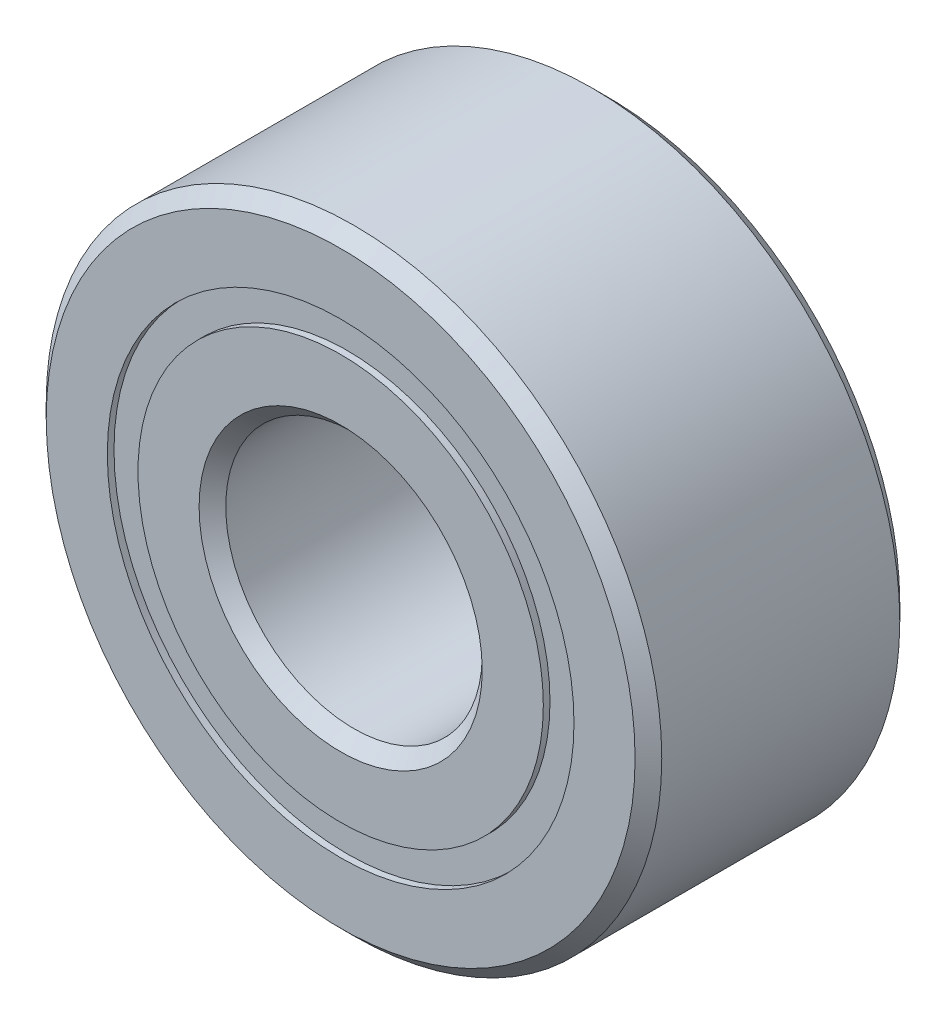
ISO-10303-21;
HEADER;
FILE_DESCRIPTION(('STEP AP214'),'2;1');
FILE_NAME('part.step','',(''),(''),'','','');
FILE_SCHEMA(('AUTOMOTIVE_DESIGN { 1 0 10303 214 1 1 1 1 }'));
ENDSEC;
DATA;
#1=APPLICATION_CONTEXT('core data for automotive mechanical design processes');
#2=APPLICATION_PROTOCOL_DEFINITION('international standard','automotive_design',2000,#1);
#3=PRODUCT_CONTEXT('',#1,'mechanical');
#4=PRODUCT('Part','Part','',(#3));
#5=PRODUCT_RELATED_PRODUCT_CATEGORY('part','',(#4));
#6=PRODUCT_DEFINITION_FORMATION('','',#4);
#7=PRODUCT_DEFINITION_CONTEXT('part definition',#1,'design');
#8=PRODUCT_DEFINITION('design','',#6,#7);
#9=PRODUCT_DEFINITION_SHAPE('','',#8);
#10=(LENGTH_UNIT() NAMED_UNIT(*) SI_UNIT(.MILLI.,.METRE.));
#11=(NAMED_UNIT(*) PLANE_ANGLE_UNIT() SI_UNIT($,.RADIAN.));
#12=(NAMED_UNIT(*) SI_UNIT($,.STERADIAN.) SOLID_ANGLE_UNIT());
#13=UNCERTAINTY_MEASURE_WITH_UNIT(LENGTH_MEASURE(1.E-05),#10,'distance_accuracy_value','');
#14=(GEOMETRIC_REPRESENTATION_CONTEXT(3) GLOBAL_UNCERTAINTY_ASSIGNED_CONTEXT((#13)) GLOBAL_UNIT_ASSIGNED_CONTEXT((#10,
#11,#12)) REPRESENTATION_CONTEXT('',''));
#15=CARTESIAN_POINT('',(0.,0.,0.));
#16=DIRECTION('',(0.,0.,1.));
#17=DIRECTION('',(1.,0.,0.));
#18=AXIS2_PLACEMENT_3D('',#15,#16,#17);
#19=CARTESIAN_POINT('',(0.,1.97554945054946,1.3));
#20=DIRECTION('',(0.,0.,-1.));
#21=DIRECTION('',(-1.,0.,0.));
#22=AXIS2_PLACEMENT_3D('',#19,#20,#21);
#23=PLANE('',#22);
#24=CARTESIAN_POINT('',(0.,0.,1.3));
#25=DIRECTION('',(0.,0.,1.));
#26=DIRECTION('',(1.,0.,0.));
#27=AXIS2_PLACEMENT_3D('',#24,#25,#26);
#28=CIRCLE('',#27,1.38);
#29=CARTESIAN_POINT('',(1.38,0.,1.3));
#30=VERTEX_POINT('',#29);
#31=EDGE_CURVE('P0_E43',#30,#30,#28,.T.);
#32=ORIENTED_EDGE('',*,*,#31,.F.);
#33=EDGE_LOOP('',(#32));
#34=FACE_BOUND('',#33,.T.);
#35=CARTESIAN_POINT('',(0.,0.,1.3));
#36=DIRECTION('',(0.,0.,1.));
#37=DIRECTION('',(1.,0.,0.));
#38=AXIS2_PLACEMENT_3D('',#35,#36,#37);
#39=CIRCLE('',#38,1.97554945054946);
#40=CARTESIAN_POINT('',(1.97554945054946,0.,1.3));
#41=VERTEX_POINT('',#40);
#42=EDGE_CURVE('P0_E10',#41,#41,#39,.T.);
#43=ORIENTED_EDGE('',*,*,#42,.T.);
#44=EDGE_LOOP('',(#43));
#45=FACE_BOUND('',#44,.T.);
#46=ADVANCED_FACE('P0_F15',(#34,#45),#23,.F.);
#47=CARTESIAN_POINT('',(0.,0.,1.3));
#48=DIRECTION('',(0.,0.,1.));
#49=DIRECTION('',(1.,0.,0.));
#50=AXIS2_PLACEMENT_3D('',#47,#48,#49);
#51=CYLINDRICAL_SURFACE('',#50,1.97554945054946);
#52=ORIENTED_EDGE('',*,*,#42,.F.);
#53=EDGE_LOOP('',(#52));
#54=FACE_BOUND('',#53,.T.);
#55=CARTESIAN_POINT('',(0.,0.,0.577777777777777));
#56=DIRECTION('',(0.,0.,1.));
#57=DIRECTION('',(1.,0.,0.));
#58=AXIS2_PLACEMENT_3D('',#55,#56,#57);
#59=CIRCLE('',#58,1.97554945054946);
#60=CARTESIAN_POINT('',(1.97554945054946,0.,0.577777777777777));
#61=VERTEX_POINT('',#60);
#62=EDGE_CURVE('P0_E21',#61,#61,#59,.T.);
#63=ORIENTED_EDGE('',*,*,#62,.T.);
#64=EDGE_LOOP('',(#63));
#65=FACE_BOUND('',#64,.T.);
#66=ADVANCED_FACE('P0_F50',(#54,#65),#51,.T.);
#67=CARTESIAN_POINT('',(0.,0.,0.));
#68=DIRECTION('',(0.,0.,1.));
#69=DIRECTION('',(1.,0.,0.));
#70=AXIS2_PLACEMENT_3D('',#67,#68,#69);
#71=TOROIDAL_SURFACE('',#70,2.125,0.596793621970691);
#72=ORIENTED_EDGE('',*,*,#62,.F.);
#73=EDGE_LOOP('',(#72));
#74=FACE_BOUND('',#73,.T.);
#75=CARTESIAN_POINT('',(0.,0.,-0.577777777777778));
#76=DIRECTION('',(0.,0.,1.));
#77=DIRECTION('',(1.,0.,0.));
#78=AXIS2_PLACEMENT_3D('',#75,#76,#77);
#79=CIRCLE('',#78,1.97554945054946);
#80=CARTESIAN_POINT('',(1.97554945054946,0.,-0.577777777777778));
#81=VERTEX_POINT('',#80);
#82=EDGE_CURVE('P0_E25',#81,#81,#79,.T.);
#83=ORIENTED_EDGE('',*,*,#82,.T.);
#84=EDGE_LOOP('',(#83));
#85=FACE_BOUND('',#84,.T.);
#86=ADVANCED_FACE('P0_F55',(#74,#85),#71,.F.);
#87=CARTESIAN_POINT('',(0.,0.,1.3));
#88=DIRECTION('',(0.,0.,1.));
#89=DIRECTION('',(1.,0.,0.));
#90=AXIS2_PLACEMENT_3D('',#87,#88,#89);
#91=CYLINDRICAL_SURFACE('',#90,1.97554945054946);
#92=ORIENTED_EDGE('',*,*,#82,.F.);
#93=EDGE_LOOP('',(#92));
#94=FACE_BOUND('',#93,.T.);
#95=CARTESIAN_POINT('',(0.,0.,-1.3));
#96=DIRECTION('',(0.,0.,1.));
#97=DIRECTION('',(1.,0.,0.));
#98=AXIS2_PLACEMENT_3D('',#95,#96,#97);
#99=CIRCLE('',#98,1.97554945054946);
#100=CARTESIAN_POINT('',(1.97554945054946,0.,-1.3));
#101=VERTEX_POINT('',#100);
#102=EDGE_CURVE('P0_E29',#101,#101,#99,.T.);
#103=ORIENTED_EDGE('',*,*,#102,.T.);
#104=EDGE_LOOP('',(#103));
#105=FACE_BOUND('',#104,.T.);
#106=ADVANCED_FACE('P0_F60',(#94,#105),#91,.T.);
#107=CARTESIAN_POINT('',(0.,1.38,-1.3));
#108=DIRECTION('',(0.,0.,1.));
#109=DIRECTION('',(1.,0.,0.));
#110=AXIS2_PLACEMENT_3D('',#107,#108,#109);
#111=PLANE('',#110);
#112=ORIENTED_EDGE('',*,*,#102,.F.);
#113=EDGE_LOOP('',(#112));
#114=FACE_BOUND('',#113,.T.);
#115=CARTESIAN_POINT('',(0.,0.,-1.3));
#116=DIRECTION('',(0.,0.,1.));
#117=DIRECTION('',(1.,0.,0.));
#118=AXIS2_PLACEMENT_3D('',#115,#116,#117);
#119=CIRCLE('',#118,1.38);
#120=CARTESIAN_POINT('',(1.38,0.,-1.3));
#121=VERTEX_POINT('',#120);
#122=EDGE_CURVE('P0_E34',#121,#121,#119,.T.);
#123=ORIENTED_EDGE('',*,*,#122,.T.);
#124=EDGE_LOOP('',(#123));
#125=FACE_BOUND('',#124,.T.);
#126=ADVANCED_FACE('P0_F66',(#114,#125),#111,.F.);
#127=CARTESIAN_POINT('',(0.,0.,-1.17));
#128=DIRECTION('',(0.,0.,-1.));
#129=DIRECTION('',(-1.,0.,0.));
#130=AXIS2_PLACEMENT_3D('',#127,#128,#129);
#131=CONICAL_SURFACE('',#130,1.25,0.785398163397436);
#132=ORIENTED_EDGE('',*,*,#122,.F.);
#133=EDGE_LOOP('',(#132));
#134=FACE_BOUND('',#133,.T.);
#135=CARTESIAN_POINT('',(0.,0.,-1.17));
#136=DIRECTION('',(0.,0.,1.));
#137=DIRECTION('',(1.,0.,0.));
#138=AXIS2_PLACEMENT_3D('',#135,#136,#137);
#139=CIRCLE('',#138,1.25);
#140=CARTESIAN_POINT('',(1.25,0.,-1.17));
#141=VERTEX_POINT('',#140);
#142=EDGE_CURVE('P0_E37',#141,#141,#139,.T.);
#143=ORIENTED_EDGE('',*,*,#142,.T.);
#144=EDGE_LOOP('',(#143));
#145=FACE_BOUND('',#144,.T.);
#146=ADVANCED_FACE('P0_F70',(#134,#145),#131,.F.);
#147=CARTESIAN_POINT('',(0.,0.,1.3));
#148=DIRECTION('',(0.,0.,1.));
#149=DIRECTION('',(1.,0.,0.));
#150=AXIS2_PLACEMENT_3D('',#147,#148,#149);
#151=CYLINDRICAL_SURFACE('',#150,1.25);
#152=ORIENTED_EDGE('',*,*,#142,.F.);
#153=EDGE_LOOP('',(#152));
#154=FACE_BOUND('',#153,.T.);
#155=CARTESIAN_POINT('',(0.,0.,1.17));
#156=DIRECTION('',(0.,0.,1.));
#157=DIRECTION('',(1.,0.,0.));
#158=AXIS2_PLACEMENT_3D('',#155,#156,#157);
#159=CIRCLE('',#158,1.25);
#160=CARTESIAN_POINT('',(1.25,0.,1.17));
#161=VERTEX_POINT('',#160);
#162=EDGE_CURVE('P0_E40',#161,#161,#159,.T.);
#163=ORIENTED_EDGE('',*,*,#162,.T.);
#164=EDGE_LOOP('',(#163));
#165=FACE_BOUND('',#164,.T.);
#166=ADVANCED_FACE('P0_F74',(#154,#165),#151,.F.);
#167=CARTESIAN_POINT('',(0.,0.,1.3));
#168=DIRECTION('',(0.,0.,1.));
#169=DIRECTION('',(1.,0.,0.));
#170=AXIS2_PLACEMENT_3D('',#167,#168,#169);
#171=CONICAL_SURFACE('',#170,1.38,0.785398163397462);
#172=ORIENTED_EDGE('',*,*,#162,.F.);
#173=EDGE_LOOP('',(#172));
#174=FACE_BOUND('',#173,.T.);
#175=ORIENTED_EDGE('',*,*,#31,.T.);
#176=EDGE_LOOP('',(#175));
#177=FACE_BOUND('',#176,.T.);
#178=ADVANCED_FACE('P0_F47',(#174,#177),#171,.F.);
#179=CLOSED_SHELL('',(#46,#66,#86,#106,#126,#146,#166,#178));
#180=MANIFOLD_SOLID_BREP('P0_B1',#179);
#181=CARTESIAN_POINT('',(-2.02099509712719,0.656661113046786,0.));
#182=DIRECTION('',(0.,0.,1.));
#183=DIRECTION('',(-0.95105651629515,0.309016994374958,0.));
#184=AXIS2_PLACEMENT_3D('',#181,#182,#183);
#185=SPHERICAL_SURFACE('',#184,0.596793621970693);
#186=CARTESIAN_POINT('',(-2.02099509712719,0.656661113046786,0.596793621970692));
#187=VERTEX_POINT('',#186);
#188=VERTEX_LOOP('',#187);
#189=FACE_BOUND('',#188,.T.);
#190=ADVANCED_FACE('P1_F13',(#189),#185,.T.);
#191=CLOSED_SHELL('',(#190));
#192=MANIFOLD_SOLID_BREP('P1_B1',#191);
#193=CARTESIAN_POINT('',(-1.24904366112148,1.71916111304678,0.));
#194=DIRECTION('',(0.,0.,1.));
#195=DIRECTION('',(-0.587785252292463,0.809016994374955,0.));
#196=AXIS2_PLACEMENT_3D('',#193,#194,#195);
#197=SPHERICAL_SURFACE('',#196,0.596793621970693);
#198=CARTESIAN_POINT('',(-1.24904366112148,1.71916111304678,0.596793621970692));
#199=VERTEX_POINT('',#198);
#200=VERTEX_LOOP('',#199);
#201=FACE_BOUND('',#200,.T.);
#202=ADVANCED_FACE('P2_F13',(#201),#197,.T.);
#203=CLOSED_SHELL('',(#202));
#204=MANIFOLD_SOLID_BREP('P2_B1',#203);
#205=CARTESIAN_POINT('',(0.,2.27445054945055,1.235));
#206=DIRECTION('',(0.,0.,-1.));
#207=DIRECTION('',(-1.,0.,0.));
#208=AXIS2_PLACEMENT_3D('',#205,#206,#207);
#209=PLANE('',#208);
#210=CARTESIAN_POINT('',(0.,0.,1.235));
#211=DIRECTION('',(0.,0.,1.));
#212=DIRECTION('',(1.,0.,0.));
#213=AXIS2_PLACEMENT_3D('',#210,#211,#212);
#214=CIRCLE('',#213,1.97554945054946);
#215=CARTESIAN_POINT('',(1.97554945054946,0.,1.235));
#216=VERTEX_POINT('',#215);
#217=EDGE_CURVE('P3_E10',#216,#216,#214,.T.);
#218=ORIENTED_EDGE('',*,*,#217,.F.);
#219=EDGE_LOOP('',(#218));
#220=FACE_BOUND('',#219,.T.);
#221=CARTESIAN_POINT('',(0.,0.,1.235));
#222=DIRECTION('',(0.,0.,1.));
#223=DIRECTION('',(1.,0.,0.));
#224=AXIS2_PLACEMENT_3D('',#221,#222,#223);
#225=CIRCLE('',#224,2.27445054945055);
#226=CARTESIAN_POINT('',(2.27445054945055,0.,1.235));
#227=VERTEX_POINT('',#226);
#228=EDGE_CURVE('P3_E29',#227,#227,#225,.T.);
#229=ORIENTED_EDGE('',*,*,#228,.T.);
#230=EDGE_LOOP('',(#229));
#231=FACE_BOUND('',#230,.T.);
#232=ADVANCED_FACE('P3_F15',(#220,#231),#209,.F.);
#233=CARTESIAN_POINT('',(0.,0.,1.3));
#234=DIRECTION('',(0.,0.,1.));
#235=DIRECTION('',(1.,0.,0.));
#236=AXIS2_PLACEMENT_3D('',#233,#234,#235);
#237=CYLINDRICAL_SURFACE('',#236,1.97554945054946);
#238=CARTESIAN_POINT('',(0.,0.,0.596793621970692));
#239=DIRECTION('',(0.,0.,1.));
#240=DIRECTION('',(1.,0.,0.));
#241=AXIS2_PLACEMENT_3D('',#238,#239,#240);
#242=CIRCLE('',#241,1.97554945054946);
#243=CARTESIAN_POINT('',(1.97554945054946,0.,0.596793621970692));
#244=VERTEX_POINT('',#243);
#245=EDGE_CURVE('P3_E21',#244,#244,#242,.T.);
#246=ORIENTED_EDGE('',*,*,#245,.F.);
#247=EDGE_LOOP('',(#246));
#248=FACE_BOUND('',#247,.T.);
#249=ORIENTED_EDGE('',*,*,#217,.T.);
#250=EDGE_LOOP('',(#249));
#251=FACE_BOUND('',#250,.T.);
#252=ADVANCED_FACE('P3_F44',(#248,#251),#237,.F.);
#253=CARTESIAN_POINT('',(0.,2.27445054945055,0.596793621970692));
#254=DIRECTION('',(0.,0.,1.));
#255=DIRECTION('',(1.,0.,0.));
#256=AXIS2_PLACEMENT_3D('',#253,#254,#255);
#257=PLANE('',#256);
#258=CARTESIAN_POINT('',(0.,0.,0.596793621970692));
#259=DIRECTION('',(0.,0.,1.));
#260=DIRECTION('',(1.,0.,0.));
#261=AXIS2_PLACEMENT_3D('',#258,#259,#260);
#262=CIRCLE('',#261,2.27445054945055);
#263=CARTESIAN_POINT('',(2.27445054945055,0.,0.596793621970692));
#264=VERTEX_POINT('',#263);
#265=EDGE_CURVE('P3_E25',#264,#264,#262,.T.);
#266=ORIENTED_EDGE('',*,*,#265,.F.);
#267=EDGE_LOOP('',(#266));
#268=FACE_BOUND('',#267,.T.);
#269=ORIENTED_EDGE('',*,*,#245,.T.);
#270=EDGE_LOOP('',(#269));
#271=FACE_BOUND('',#270,.T.);
#272=ADVANCED_FACE('P3_F39',(#268,#271),#257,.F.);
#273=CARTESIAN_POINT('',(0.,0.,1.3));
#274=DIRECTION('',(0.,0.,1.));
#275=DIRECTION('',(1.,0.,0.));
#276=AXIS2_PLACEMENT_3D('',#273,#274,#275);
#277=CYLINDRICAL_SURFACE('',#276,2.27445054945055);
#278=ORIENTED_EDGE('',*,*,#228,.F.);
#279=EDGE_LOOP('',(#278));
#280=FACE_BOUND('',#279,.T.);
#281=ORIENTED_EDGE('',*,*,#265,.T.);
#282=EDGE_LOOP('',(#281));
#283=FACE_BOUND('',#282,.T.);
#284=ADVANCED_FACE('P3_F36',(#280,#283),#277,.T.);
#285=CLOSED_SHELL('',(#232,#252,#272,#284));
#286=MANIFOLD_SOLID_BREP('P3_B1',#285);
#287=CARTESIAN_POINT('',(0.,2.27445054945055,-1.235));
#288=DIRECTION('',(0.,0.,1.));
#289=DIRECTION('',(1.,0.,0.));
#290=AXIS2_PLACEMENT_3D('',#287,#288,#289);
#291=PLANE('',#290);
#292=CARTESIAN_POINT('',(0.,0.,-1.235));
#293=DIRECTION('',(0.,0.,1.));
#294=DIRECTION('',(1.,0.,0.));
#295=AXIS2_PLACEMENT_3D('',#292,#293,#294);
#296=CIRCLE('',#295,2.27445054945055);
#297=CARTESIAN_POINT('',(2.27445054945055,0.,-1.235));
#298=VERTEX_POINT('',#297);
#299=EDGE_CURVE('P4_E29',#298,#298,#296,.T.);
#300=ORIENTED_EDGE('',*,*,#299,.F.);
#301=EDGE_LOOP('',(#300));
#302=FACE_BOUND('',#301,.T.);
#303=CARTESIAN_POINT('',(0.,0.,-1.235));
#304=DIRECTION('',(0.,0.,1.));
#305=DIRECTION('',(1.,0.,0.));
#306=AXIS2_PLACEMENT_3D('',#303,#304,#305);
#307=CIRCLE('',#306,1.97554945054946);
#308=CARTESIAN_POINT('',(1.97554945054946,0.,-1.235));
#309=VERTEX_POINT('',#308);
#310=EDGE_CURVE('P4_E10',#309,#309,#307,.T.);
#311=ORIENTED_EDGE('',*,*,#310,.T.);
#312=EDGE_LOOP('',(#311));
#313=FACE_BOUND('',#312,.T.);
#314=ADVANCED_FACE('P4_F15',(#302,#313),#291,.F.);
#315=CARTESIAN_POINT('',(0.,0.,1.3));
#316=DIRECTION('',(0.,0.,1.));
#317=DIRECTION('',(1.,0.,0.));
#318=AXIS2_PLACEMENT_3D('',#315,#316,#317);
#319=CYLINDRICAL_SURFACE('',#318,1.97554945054946);
#320=ORIENTED_EDGE('',*,*,#310,.F.);
#321=EDGE_LOOP('',(#320));
#322=FACE_BOUND('',#321,.T.);
#323=CARTESIAN_POINT('',(0.,0.,-0.596793621970694));
#324=DIRECTION('',(0.,0.,1.));
#325=DIRECTION('',(1.,0.,0.));
#326=AXIS2_PLACEMENT_3D('',#323,#324,#325);
#327=CIRCLE('',#326,1.97554945054946);
#328=CARTESIAN_POINT('',(1.97554945054946,0.,-0.596793621970694));
#329=VERTEX_POINT('',#328);
#330=EDGE_CURVE('P4_E21',#329,#329,#327,.T.);
#331=ORIENTED_EDGE('',*,*,#330,.T.);
#332=EDGE_LOOP('',(#331));
#333=FACE_BOUND('',#332,.T.);
#334=ADVANCED_FACE('P4_F38',(#322,#333),#319,.F.);
#335=CARTESIAN_POINT('',(0.,2.27445054945055,-0.596793621970694));
#336=DIRECTION('',(0.,0.,-1.));
#337=DIRECTION('',(-1.,0.,0.));
#338=AXIS2_PLACEMENT_3D('',#335,#336,#337);
#339=PLANE('',#338);
#340=ORIENTED_EDGE('',*,*,#330,.F.);
#341=EDGE_LOOP('',(#340));
#342=FACE_BOUND('',#341,.T.);
#343=CARTESIAN_POINT('',(0.,0.,-0.596793621970694));
#344=DIRECTION('',(0.,0.,1.));
#345=DIRECTION('',(1.,0.,0.));
#346=AXIS2_PLACEMENT_3D('',#343,#344,#345);
#347=CIRCLE('',#346,2.27445054945055);
#348=CARTESIAN_POINT('',(2.27445054945055,0.,-0.596793621970694));
#349=VERTEX_POINT('',#348);
#350=EDGE_CURVE('P4_E25',#349,#349,#347,.T.);
#351=ORIENTED_EDGE('',*,*,#350,.T.);
#352=EDGE_LOOP('',(#351));
#353=FACE_BOUND('',#352,.T.);
#354=ADVANCED_FACE('P4_F43',(#342,#353),#339,.F.);
#355=CARTESIAN_POINT('',(0.,0.,1.3));
#356=DIRECTION('',(0.,0.,1.));
#357=DIRECTION('',(1.,0.,0.));
#358=AXIS2_PLACEMENT_3D('',#355,#356,#357);
#359=CYLINDRICAL_SURFACE('',#358,2.27445054945055);
#360=ORIENTED_EDGE('',*,*,#350,.F.);
#361=EDGE_LOOP('',(#360));
#362=FACE_BOUND('',#361,.T.);
#363=ORIENTED_EDGE('',*,*,#299,.T.);
#364=EDGE_LOOP('',(#363));
#365=FACE_BOUND('',#364,.T.);
#366=ADVANCED_FACE('P4_F35',(#362,#365),#359,.T.);
#367=CLOSED_SHELL('',(#314,#334,#354,#366));
#368=MANIFOLD_SOLID_BREP('P4_B1',#367);
#369=CARTESIAN_POINT('',(0.,2.87,-1.3));
#370=DIRECTION('',(0.,0.,1.));
#371=DIRECTION('',(1.,0.,0.));
#372=AXIS2_PLACEMENT_3D('',#369,#370,#371);
#373=PLANE('',#372);
#374=CARTESIAN_POINT('',(0.,0.,-1.3));
#375=DIRECTION('',(0.,0.,1.));
#376=DIRECTION('',(1.,0.,0.));
#377=AXIS2_PLACEMENT_3D('',#374,#375,#376);
#378=CIRCLE('',#377,2.85);
#379=CARTESIAN_POINT('',(2.85,0.,-1.3));
#380=VERTEX_POINT('',#379);
#381=EDGE_CURVE('P5_E10',#380,#380,#378,.F.);
#382=ORIENTED_EDGE('',*,*,#381,.T.);
#383=EDGE_LOOP('',(#382));
#384=FACE_BOUND('',#383,.T.);
#385=CARTESIAN_POINT('',(0.,0.,-1.3));
#386=DIRECTION('',(0.,0.,1.));
#387=DIRECTION('',(1.,0.,0.));
#388=AXIS2_PLACEMENT_3D('',#385,#386,#387);
#389=CIRCLE('',#388,2.27445054945055);
#390=CARTESIAN_POINT('',(2.27445054945055,0.,-1.3));
#391=VERTEX_POINT('',#390);
#392=EDGE_CURVE('P5_E31',#391,#391,#389,.T.);
#393=ORIENTED_EDGE('',*,*,#392,.T.);
#394=EDGE_LOOP('',(#393));
#395=FACE_BOUND('',#394,.T.);
#396=ADVANCED_FACE('P5_F15',(#384,#395),#373,.F.);
#397=CARTESIAN_POINT('',(0.,0.,1.17));
#398=DIRECTION('',(0.,0.,-1.));
#399=DIRECTION('',(-1.,0.,0.));
#400=AXIS2_PLACEMENT_3D('',#397,#398,#399);
#401=CONICAL_SURFACE('',#400,3.,0.78539816339744);
#402=CARTESIAN_POINT('',(0.,0.,1.3));
#403=DIRECTION('',(0.,0.,1.));
#404=DIRECTION('',(1.,0.,0.));
#405=AXIS2_PLACEMENT_3D('',#402,#403,#404);
#406=CIRCLE('',#405,2.87);
#407=CARTESIAN_POINT('',(2.87,0.,1.3));
#408=VERTEX_POINT('',#407);
#409=EDGE_CURVE('P5_E36',#408,#408,#406,.T.);
#410=ORIENTED_EDGE('',*,*,#409,.F.);
#411=EDGE_LOOP('',(#410));
#412=FACE_BOUND('',#411,.T.);
#413=CARTESIAN_POINT('',(0.,0.,1.17));
#414=DIRECTION('',(0.,0.,1.));
#415=DIRECTION('',(1.,0.,0.));
#416=AXIS2_PLACEMENT_3D('',#413,#414,#415);
#417=CIRCLE('',#416,3.);
#418=CARTESIAN_POINT('',(3.,0.,1.17));
#419=VERTEX_POINT('',#418);
#420=EDGE_CURVE('P5_E27',#419,#419,#417,.T.);
#421=ORIENTED_EDGE('',*,*,#420,.T.);
#422=EDGE_LOOP('',(#421));
#423=FACE_BOUND('',#422,.T.);
#424=ADVANCED_FACE('P5_F71',(#412,#423),#401,.T.);
#425=CARTESIAN_POINT('',(0.,0.,1.3));
#426=DIRECTION('',(0.,0.,1.));
#427=DIRECTION('',(1.,0.,0.));
#428=AXIS2_PLACEMENT_3D('',#425,#426,#427);
#429=CYLINDRICAL_SURFACE('',#428,3.);
#430=CARTESIAN_POINT('',(0.,0.,-1.15));
#431=DIRECTION('',(0.,0.,1.));
#432=DIRECTION('',(1.,0.,0.));
#433=AXIS2_PLACEMENT_3D('',#430,#431,#432);
#434=CIRCLE('',#433,3.);
#435=CARTESIAN_POINT('',(3.,0.,-1.15));
#436=VERTEX_POINT('',#435);
#437=EDGE_CURVE('P5_E23',#436,#436,#434,.T.);
#438=ORIENTED_EDGE('',*,*,#437,.T.);
#439=EDGE_LOOP('',(#438));
#440=FACE_BOUND('',#439,.T.);
#441=ORIENTED_EDGE('',*,*,#420,.F.);
#442=EDGE_LOOP('',(#441));
#443=FACE_BOUND('',#442,.T.);
#444=ADVANCED_FACE('P5_F75',(#440,#443),#429,.T.);
#445=CARTESIAN_POINT('',(0.,0.,0.));
#446=DIRECTION('',(0.,0.,1.));
#447=DIRECTION('',(1.,0.,0.));
#448=AXIS2_PLACEMENT_3D('',#445,#446,#447);
#449=TOROIDAL_SURFACE('',#448,2.125,0.596793621970693);
#450=CARTESIAN_POINT('',(0.,0.,-0.5));
#451=DIRECTION('',(0.,0.,1.));
#452=DIRECTION('',(1.,0.,0.));
#453=AXIS2_PLACEMENT_3D('',#450,#451,#452);
#454=CIRCLE('',#453,2.45082606897684);
#455=CARTESIAN_POINT('',(2.45082606897684,0.,-0.5));
#456=VERTEX_POINT('',#455);
#457=EDGE_CURVE('P5_E34',#456,#456,#454,.F.);
#458=ORIENTED_EDGE('',*,*,#457,.T.);
#459=EDGE_LOOP('',(#458));
#460=FACE_BOUND('',#459,.T.);
#461=CARTESIAN_POINT('',(0.,0.,0.577777777777777));
#462=DIRECTION('',(0.,0.,1.));
#463=DIRECTION('',(1.,0.,0.));
#464=AXIS2_PLACEMENT_3D('',#461,#462,#463);
#465=CIRCLE('',#464,2.27445054945055);
#466=CARTESIAN_POINT('',(2.27445054945055,0.,0.577777777777777));
#467=VERTEX_POINT('',#466);
#468=EDGE_CURVE('P5_E41',#467,#467,#465,.T.);
#469=ORIENTED_EDGE('',*,*,#468,.T.);
#470=EDGE_LOOP('',(#469));
#471=FACE_BOUND('',#470,.T.);
#472=ADVANCED_FACE('P5_F80',(#460,#471),#449,.F.);
#473=CARTESIAN_POINT('',(0.,0.,1.3));
#474=DIRECTION('',(0.,0.,1.));
#475=DIRECTION('',(1.,0.,0.));
#476=AXIS2_PLACEMENT_3D('',#473,#474,#475);
#477=CYLINDRICAL_SURFACE('',#476,2.27445054945055);
#478=ORIENTED_EDGE('',*,*,#468,.F.);
#479=EDGE_LOOP('',(#478));
#480=FACE_BOUND('',#479,.T.);
#481=CARTESIAN_POINT('',(0.,0.,1.3));
#482=DIRECTION('',(0.,0.,1.));
#483=DIRECTION('',(1.,0.,0.));
#484=AXIS2_PLACEMENT_3D('',#481,#482,#483);
#485=CIRCLE('',#484,2.27445054945055);
#486=CARTESIAN_POINT('',(2.27445054945055,0.,1.3));
#487=VERTEX_POINT('',#486);
#488=EDGE_CURVE('P5_E44',#487,#487,#485,.T.);
#489=ORIENTED_EDGE('',*,*,#488,.T.);
#490=EDGE_LOOP('',(#489));
#491=FACE_BOUND('',#490,.T.);
#492=ADVANCED_FACE('P5_F84',(#480,#491),#477,.F.);
#493=CARTESIAN_POINT('',(0.,2.87,1.3));
#494=DIRECTION('',(0.,0.,-1.));
#495=DIRECTION('',(-1.,0.,0.));
#496=AXIS2_PLACEMENT_3D('',#493,#494,#495);
#497=PLANE('',#496);
#498=ORIENTED_EDGE('',*,*,#488,.F.);
#499=EDGE_LOOP('',(#498));
#500=FACE_BOUND('',#499,.T.);
#501=ORIENTED_EDGE('',*,*,#409,.T.);
#502=EDGE_LOOP('',(#501));
#503=FACE_BOUND('',#502,.T.);
#504=ADVANCED_FACE('P5_F65',(#500,#503),#497,.F.);
#505=CARTESIAN_POINT('',(0.,2.27445054945055,-0.5));
#506=DIRECTION('',(0.,0.,1.));
#507=DIRECTION('',(1.,0.,0.));
#508=AXIS2_PLACEMENT_3D('',#505,#506,#507);
#509=PLANE('',#508);
#510=CARTESIAN_POINT('',(0.,0.,-0.5));
#511=DIRECTION('',(0.,0.,-1.));
#512=DIRECTION('',(-1.,0.,0.));
#513=AXIS2_PLACEMENT_3D('',#510,#511,#512);
#514=CIRCLE('',#513,2.27445054945055);
#515=CARTESIAN_POINT('',(-2.27445054945055,0.,-0.5));
#516=VERTEX_POINT('',#515);
#517=EDGE_CURVE('P5_E37',#516,#516,#514,.T.);
#518=ORIENTED_EDGE('',*,*,#517,.T.);
#519=EDGE_LOOP('',(#518));
#520=FACE_BOUND('',#519,.T.);
#521=ORIENTED_EDGE('',*,*,#457,.F.);
#522=EDGE_LOOP('',(#521));
#523=FACE_BOUND('',#522,.T.);
#524=ADVANCED_FACE('P5_F52',(#520,#523),#509,.T.);
#525=CARTESIAN_POINT('',(0.,0.,1.3));
#526=DIRECTION('',(0.,0.,1.));
#527=DIRECTION('',(1.,0.,0.));
#528=AXIS2_PLACEMENT_3D('',#525,#526,#527);
#529=CYLINDRICAL_SURFACE('',#528,2.27445054945055);
#530=ORIENTED_EDGE('',*,*,#392,.F.);
#531=EDGE_LOOP('',(#530));
#532=FACE_BOUND('',#531,.T.);
#533=ORIENTED_EDGE('',*,*,#517,.F.);
#534=EDGE_LOOP('',(#533));
#535=FACE_BOUND('',#534,.T.);
#536=ADVANCED_FACE('P5_F55',(#532,#535),#529,.F.);
#537=CARTESIAN_POINT('',(0.,0.,-1.15));
#538=DIRECTION('',(0.,0.,1.));
#539=DIRECTION('',(1.,0.,0.));
#540=AXIS2_PLACEMENT_3D('',#537,#538,#539);
#541=CONICAL_SURFACE('',#540,3.,0.78539816339745);
#542=ORIENTED_EDGE('',*,*,#381,.F.);
#543=EDGE_LOOP('',(#542));
#544=FACE_BOUND('',#543,.T.);
#545=ORIENTED_EDGE('',*,*,#437,.F.);
#546=EDGE_LOOP('',(#545));
#547=FACE_BOUND('',#546,.T.);
#548=ADVANCED_FACE('P5_F18',(#544,#547),#541,.T.);
#549=CLOSED_SHELL('',(#396,#424,#444,#472,#492,#504,#524,#536,#548));
#550=MANIFOLD_SOLID_BREP('P5_B1',#549);
#551=CARTESIAN_POINT('',(0.,2.125,0.));
#552=DIRECTION('',(0.,0.,1.));
#553=DIRECTION('',(0.,1.,0.));
#554=AXIS2_PLACEMENT_3D('',#551,#552,#553);
#555=SPHERICAL_SURFACE('',#554,0.596793621970693);
#556=CARTESIAN_POINT('',(0.,2.125,0.596793621970692));
#557=VERTEX_POINT('',#556);
#558=VERTEX_LOOP('',#557);
#559=FACE_BOUND('',#558,.T.);
#560=ADVANCED_FACE('P6_F13',(#559),#555,.T.);
#561=CLOSED_SHELL('',(#560));
#562=MANIFOLD_SOLID_BREP('P6_B1',#561);
#563=CARTESIAN_POINT('',(1.24904366112151,1.71916111304676,0.));
#564=DIRECTION('',(0.,0.,1.));
#565=DIRECTION('',(0.587785252292474,0.809016994374947,0.));
#566=AXIS2_PLACEMENT_3D('',#563,#564,#565);
#567=SPHERICAL_SURFACE('',#566,0.596793621970693);
#568=CARTESIAN_POINT('',(1.24904366112151,1.71916111304676,0.596793621970692));
#569=VERTEX_POINT('',#568);
#570=VERTEX_LOOP('',#569);
#571=FACE_BOUND('',#570,.T.);
#572=ADVANCED_FACE('P7_F13',(#571),#567,.T.);
#573=CLOSED_SHELL('',(#572));
#574=MANIFOLD_SOLID_BREP('P7_B1',#573);
#575=CARTESIAN_POINT('',(2.02099509712721,0.656661113046758,0.));
#576=DIRECTION('',(0.,0.,1.));
#577=DIRECTION('',(0.951056516295155,0.309016994374945,0.));
#578=AXIS2_PLACEMENT_3D('',#575,#576,#577);
#579=SPHERICAL_SURFACE('',#578,0.596793621970693);
#580=CARTESIAN_POINT('',(2.02099509712721,0.656661113046758,0.596793621970692));
#581=VERTEX_POINT('',#580);
#582=VERTEX_LOOP('',#581);
#583=FACE_BOUND('',#582,.T.);
#584=ADVANCED_FACE('P8_F13',(#583),#579,.T.);
#585=CLOSED_SHELL('',(#584));
#586=MANIFOLD_SOLID_BREP('P8_B1',#585);
#587=CARTESIAN_POINT('',(2.0209950971272,-0.656661113046772,0.));
#588=DIRECTION('',(0.,0.,1.));
#589=DIRECTION('',(0.951056516295152,-0.309016994374952,0.));
#590=AXIS2_PLACEMENT_3D('',#587,#588,#589);
#591=SPHERICAL_SURFACE('',#590,0.596793621970693);
#592=CARTESIAN_POINT('',(2.0209950971272,-0.656661113046772,0.596793621970692));
#593=VERTEX_POINT('',#592);
#594=VERTEX_LOOP('',#593);
#595=FACE_BOUND('',#594,.T.);
#596=ADVANCED_FACE('P9_F13',(#595),#591,.T.);
#597=CLOSED_SHELL('',(#596));
#598=MANIFOLD_SOLID_BREP('P9_B1',#597);
#599=CARTESIAN_POINT('',(1.2490436611215,-1.71916111304677,0.));
#600=DIRECTION('',(0.,0.,1.));
#601=DIRECTION('',(0.587785252292469,-0.809016994374951,0.));
#602=AXIS2_PLACEMENT_3D('',#599,#600,#601);
#603=SPHERICAL_SURFACE('',#602,0.596793621970693);
#604=CARTESIAN_POINT('',(1.2490436611215,-1.71916111304677,0.596793621970692));
#605=VERTEX_POINT('',#604);
#606=VERTEX_LOOP('',#605);
#607=FACE_BOUND('',#606,.T.);
#608=ADVANCED_FACE('P10_F13',(#607),#603,.T.);
#609=CLOSED_SHELL('',(#608));
#610=MANIFOLD_SOLID_BREP('P10_B1',#609);
#611=CARTESIAN_POINT('',(0.,-2.125,0.));
#612=DIRECTION('',(0.,0.,1.));
#613=DIRECTION('',(0.,-1.,0.));
#614=AXIS2_PLACEMENT_3D('',#611,#612,#613);
#615=SPHERICAL_SURFACE('',#614,0.596793621970693);
#616=CARTESIAN_POINT('',(0.,-2.125,0.596793621970692));
#617=VERTEX_POINT('',#616);
#618=VERTEX_LOOP('',#617);
#619=FACE_BOUND('',#618,.T.);
#620=ADVANCED_FACE('P11_F13',(#619),#615,.T.);
#621=CLOSED_SHELL('',(#620));
#622=MANIFOLD_SOLID_BREP('P11_B1',#621);
#623=CARTESIAN_POINT('',(-1.24904366112152,-1.71916111304676,0.));
#624=DIRECTION('',(0.,0.,1.));
#625=DIRECTION('',(-0.58778525229248,-0.809016994374942,0.));
#626=AXIS2_PLACEMENT_3D('',#623,#624,#625);
#627=SPHERICAL_SURFACE('',#626,0.596793621970693);
#628=CARTESIAN_POINT('',(-1.24904366112152,-1.71916111304676,0.596793621970692));
#629=VERTEX_POINT('',#628);
#630=VERTEX_LOOP('',#629);
#631=FACE_BOUND('',#630,.T.);
#632=ADVANCED_FACE('P12_F13',(#631),#627,.T.);
#633=CLOSED_SHELL('',(#632));
#634=MANIFOLD_SOLID_BREP('P12_B1',#633);
#635=CARTESIAN_POINT('',(-2.02099509712721,-0.656661113046744,0.));
#636=DIRECTION('',(0.,0.,1.));
#637=DIRECTION('',(-0.951056516295157,-0.309016994374939,0.));
#638=AXIS2_PLACEMENT_3D('',#635,#636,#637);
#639=SPHERICAL_SURFACE('',#638,0.596793621970693);
#640=CARTESIAN_POINT('',(-2.02099509712721,-0.656661113046744,0.596793621970692));
#641=VERTEX_POINT('',#640);
#642=VERTEX_LOOP('',#641);
#643=FACE_BOUND('',#642,.T.);
#644=ADVANCED_FACE('P13_F13',(#643),#639,.T.);
#645=CLOSED_SHELL('',(#644));
#646=MANIFOLD_SOLID_BREP('P13_B1',#645);
#647=ADVANCED_BREP_SHAPE_REPRESENTATION('',(#18,#180,#192,#204,#286,#368,#550,#562,#574,#586,
#598,#610,#622,#634,#646),#14);
#648=SHAPE_DEFINITION_REPRESENTATION(#9,#647);
ENDSEC;
END-ISO-10303-21;
